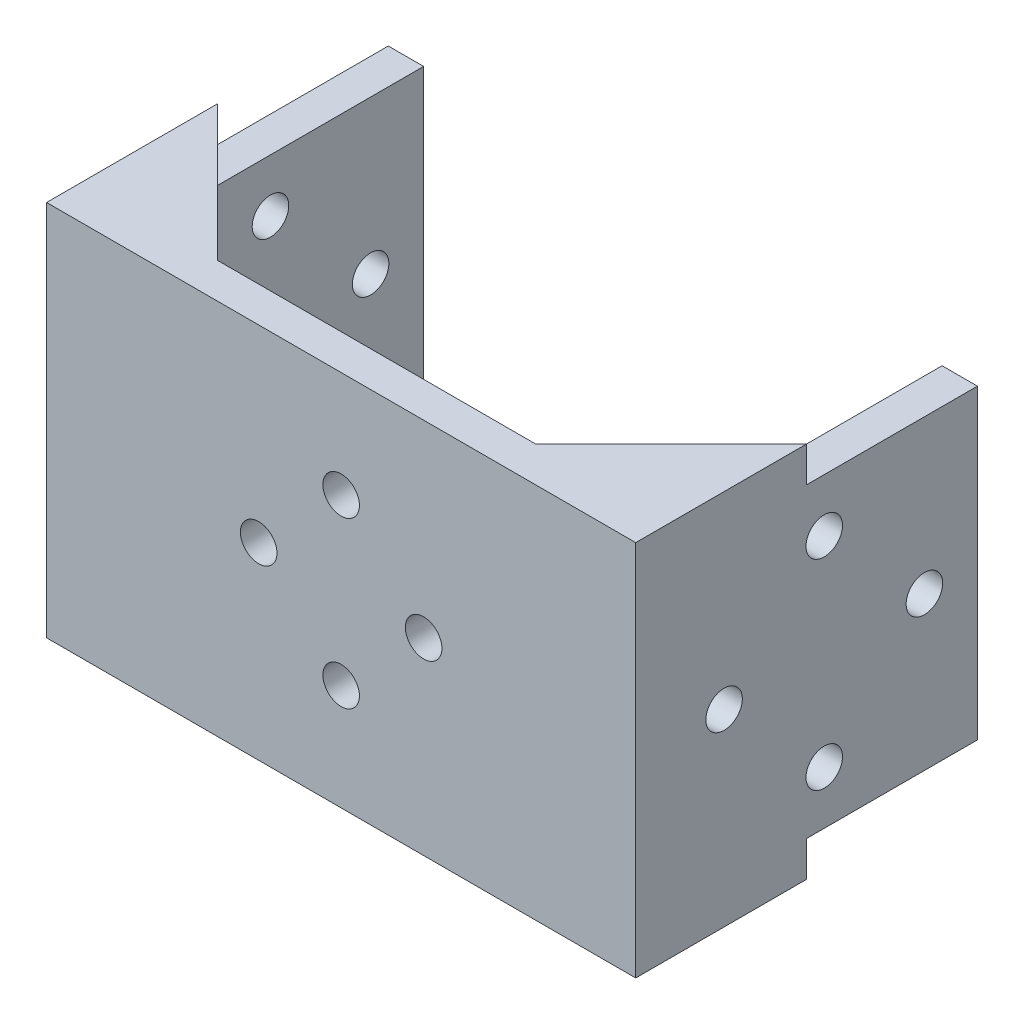
ISO-10303-21;
HEADER;
FILE_DESCRIPTION(('STEP AP214'),'2;1');
FILE_NAME('part.step','',(''),(''),'','','');
FILE_SCHEMA(('AUTOMOTIVE_DESIGN { 1 0 10303 214 1 1 1 1 }'));
ENDSEC;
DATA;
#1=APPLICATION_CONTEXT('core data for automotive mechanical design processes');
#2=APPLICATION_PROTOCOL_DEFINITION('international standard','automotive_design',2000,#1);
#3=PRODUCT_CONTEXT('',#1,'mechanical');
#4=PRODUCT('Part','Part','',(#3));
#5=PRODUCT_RELATED_PRODUCT_CATEGORY('part','',(#4));
#6=PRODUCT_DEFINITION_FORMATION('','',#4);
#7=PRODUCT_DEFINITION_CONTEXT('part definition',#1,'design');
#8=PRODUCT_DEFINITION('design','',#6,#7);
#9=PRODUCT_DEFINITION_SHAPE('','',#8);
#10=(LENGTH_UNIT() NAMED_UNIT(*) SI_UNIT(.MILLI.,.METRE.));
#11=(NAMED_UNIT(*) PLANE_ANGLE_UNIT() SI_UNIT($,.RADIAN.));
#12=(NAMED_UNIT(*) SI_UNIT($,.STERADIAN.) SOLID_ANGLE_UNIT());
#13=UNCERTAINTY_MEASURE_WITH_UNIT(LENGTH_MEASURE(1.E-05),#10,'distance_accuracy_value','');
#14=(GEOMETRIC_REPRESENTATION_CONTEXT(3) GLOBAL_UNCERTAINTY_ASSIGNED_CONTEXT((#13)) GLOBAL_UNIT_ASSIGNED_CONTEXT((#10,
#11,#12)) REPRESENTATION_CONTEXT('',''));
#15=CARTESIAN_POINT('',(0.,0.,0.));
#16=DIRECTION('',(0.,0.,1.));
#17=DIRECTION('',(1.,0.,0.));
#18=AXIS2_PLACEMENT_3D('',#15,#16,#17);
#19=CARTESIAN_POINT('',(-25.,-13.,3.));
#20=DIRECTION('',(0.,1.,0.));
#21=DIRECTION('',(0.,0.,1.));
#22=AXIS2_PLACEMENT_3D('',#19,#20,#21);
#23=PLANE('',#22);
#24=DIRECTION('',(0.,0.,-1.));
#25=VECTOR('',#24,1.);
#26=CARTESIAN_POINT('',(25.,-13.,3.));
#27=LINE('',#26,#25);
#28=CARTESIAN_POINT('',(25.,-13.,-11.5));
#29=VERTEX_POINT('',#28);
#30=CARTESIAN_POINT('',(25.,-13.,-26.));
#31=VERTEX_POINT('',#30);
#32=EDGE_CURVE('E428',#29,#31,#27,.T.);
#33=ORIENTED_EDGE('',*,*,#32,.F.);
#34=DIRECTION('',(-0.707106781186541,0.,0.707106781186554));
#35=VECTOR('',#34,1.);
#36=CARTESIAN_POINT('',(-7.24999999999956,-13.,20.7500000000001));
#37=LINE('',#36,#35);
#38=CARTESIAN_POINT('',(22.,-13.,-8.49999999999994));
#39=VERTEX_POINT('',#38);
#40=EDGE_CURVE('E198',#29,#39,#37,.T.);
#41=ORIENTED_EDGE('',*,*,#40,.T.);
#42=DIRECTION('',(0.,0.,1.));
#43=VECTOR('',#42,1.);
#44=CARTESIAN_POINT('',(22.,-13.,3.));
#45=LINE('',#44,#43);
#46=CARTESIAN_POINT('',(22.,-13.,-26.));
#47=VERTEX_POINT('',#46);
#48=EDGE_CURVE('E305',#47,#39,#45,.T.);
#49=ORIENTED_EDGE('',*,*,#48,.F.);
#50=DIRECTION('',(1.,0.,0.));
#51=VECTOR('',#50,1.);
#52=CARTESIAN_POINT('',(22.,-13.,-26.));
#53=LINE('',#52,#51);
#54=EDGE_CURVE('E317',#47,#31,#53,.T.);
#55=ORIENTED_EDGE('',*,*,#54,.T.);
#56=EDGE_LOOP('',(#33,#41,#49,#55));
#57=FACE_BOUND('',#56,.T.);
#58=ADVANCED_FACE('F39',(#57),#23,.F.);
#59=CARTESIAN_POINT('',(-25.,13.,3.));
#60=DIRECTION('',(0.,-1.,0.));
#61=DIRECTION('',(0.,0.,-1.));
#62=AXIS2_PLACEMENT_3D('',#59,#60,#61);
#63=PLANE('',#62);
#64=DIRECTION('',(-0.707106781186556,0.,-0.707106781186539));
#65=VECTOR('',#64,1.);
#66=CARTESIAN_POINT('',(-25.,13.,-11.5));
#67=LINE('',#66,#65);
#68=CARTESIAN_POINT('',(-22.,13.,-8.50000000000007));
#69=VERTEX_POINT('',#68);
#70=CARTESIAN_POINT('',(-25.,13.,-11.5));
#71=VERTEX_POINT('',#70);
#72=EDGE_CURVE('E49',#69,#71,#67,.T.);
#73=ORIENTED_EDGE('',*,*,#72,.F.);
#74=DIRECTION('',(0.,0.,-1.));
#75=VECTOR('',#74,1.);
#76=CARTESIAN_POINT('',(-22.,13.,3.));
#77=LINE('',#76,#75);
#78=CARTESIAN_POINT('',(-22.,13.,-26.));
#79=VERTEX_POINT('',#78);
#80=EDGE_CURVE('E368',#69,#79,#77,.T.);
#81=ORIENTED_EDGE('',*,*,#80,.T.);
#82=DIRECTION('',(-1.,0.,0.));
#83=VECTOR('',#82,1.);
#84=CARTESIAN_POINT('',(-22.,13.,-26.));
#85=LINE('',#84,#83);
#86=CARTESIAN_POINT('',(-25.,13.,-26.));
#87=VERTEX_POINT('',#86);
#88=EDGE_CURVE('E378',#79,#87,#85,.T.);
#89=ORIENTED_EDGE('',*,*,#88,.T.);
#90=DIRECTION('',(0.,0.,-1.));
#91=VECTOR('',#90,1.);
#92=CARTESIAN_POINT('',(-25.,13.,3.));
#93=LINE('',#92,#91);
#94=EDGE_CURVE('E439',#71,#87,#93,.T.);
#95=ORIENTED_EDGE('',*,*,#94,.F.);
#96=EDGE_LOOP('',(#73,#81,#89,#95));
#97=FACE_BOUND('',#96,.T.);
#98=ADVANCED_FACE('F516',(#97),#63,.F.);
#99=DIRECTION('',(-0.707106781186541,0.,0.707106781186554));
#100=VECTOR('',#99,1.);
#101=CARTESIAN_POINT('',(25.,13.,-11.5));
#102=LINE('',#101,#100);
#103=CARTESIAN_POINT('',(25.,13.,-11.5));
#104=VERTEX_POINT('',#103);
#105=CARTESIAN_POINT('',(22.,13.,-8.49999999999994));
#106=VERTEX_POINT('',#105);
#107=EDGE_CURVE('E250',#104,#106,#102,.T.);
#108=ORIENTED_EDGE('',*,*,#107,.F.);
#109=DIRECTION('',(0.,0.,-1.));
#110=VECTOR('',#109,1.);
#111=CARTESIAN_POINT('',(25.,13.,3.));
#112=LINE('',#111,#110);
#113=CARTESIAN_POINT('',(25.,13.,-26.));
#114=VERTEX_POINT('',#113);
#115=EDGE_CURVE('E43',#104,#114,#112,.T.);
#116=ORIENTED_EDGE('',*,*,#115,.T.);
#117=DIRECTION('',(1.,0.,0.));
#118=VECTOR('',#117,1.);
#119=CARTESIAN_POINT('',(22.,13.,-26.));
#120=LINE('',#119,#118);
#121=CARTESIAN_POINT('',(22.,13.,-26.));
#122=VERTEX_POINT('',#121);
#123=EDGE_CURVE('E324',#122,#114,#120,.T.);
#124=ORIENTED_EDGE('',*,*,#123,.F.);
#125=DIRECTION('',(0.,0.,-1.));
#126=VECTOR('',#125,1.);
#127=CARTESIAN_POINT('',(22.,13.,2.99999999999999));
#128=LINE('',#127,#126);
#129=EDGE_CURVE('E309',#106,#122,#128,.T.);
#130=ORIENTED_EDGE('',*,*,#129,.F.);
#131=EDGE_LOOP('',(#108,#116,#124,#130));
#132=FACE_BOUND('',#131,.T.);
#133=ADVANCED_FACE('F497',(#132),#63,.F.);
#134=CARTESIAN_POINT('',(0.,0.,3.));
#135=DIRECTION('',(0.,0.,-1.));
#136=DIRECTION('',(-1.,0.,0.));
#137=AXIS2_PLACEMENT_3D('',#134,#135,#136);
#138=PLANE('',#137);
#139=DIRECTION('',(0.,-1.,0.));
#140=VECTOR('',#139,1.);
#141=CARTESIAN_POINT('',(-25.,-13.,3.));
#142=LINE('',#141,#140);
#143=CARTESIAN_POINT('',(-25.,16.,3.));
#144=VERTEX_POINT('',#143);
#145=CARTESIAN_POINT('',(-25.,-16.,3.));
#146=VERTEX_POINT('',#145);
#147=EDGE_CURVE('E177',#144,#146,#142,.T.);
#148=ORIENTED_EDGE('',*,*,#147,.T.);
#149=DIRECTION('',(1.,0.,0.));
#150=VECTOR('',#149,1.);
#151=CARTESIAN_POINT('',(-25.,-16.,3.));
#152=LINE('',#151,#150);
#153=CARTESIAN_POINT('',(25.,-16.,3.));
#154=VERTEX_POINT('',#153);
#155=EDGE_CURVE('E185',#146,#154,#152,.T.);
#156=ORIENTED_EDGE('',*,*,#155,.T.);
#157=DIRECTION('',(0.,1.,0.));
#158=VECTOR('',#157,1.);
#159=CARTESIAN_POINT('',(25.,-13.,3.));
#160=LINE('',#159,#158);
#161=CARTESIAN_POINT('',(25.,16.,3.));
#162=VERTEX_POINT('',#161);
#163=EDGE_CURVE('E166',#154,#162,#160,.T.);
#164=ORIENTED_EDGE('',*,*,#163,.T.);
#165=DIRECTION('',(1.,0.,0.));
#166=VECTOR('',#165,1.);
#167=CARTESIAN_POINT('',(-25.,16.,3.));
#168=LINE('',#167,#166);
#169=EDGE_CURVE('E230',#144,#162,#168,.T.);
#170=ORIENTED_EDGE('',*,*,#169,.F.);
#171=EDGE_LOOP('',(#148,#156,#164,#170));
#172=FACE_BOUND('',#171,.T.);
#173=CARTESIAN_POINT('',(-7.,0.,3.));
#174=DIRECTION('',(0.,0.,1.));
#175=DIRECTION('',(1.,0.,0.));
#176=AXIS2_PLACEMENT_3D('',#173,#174,#175);
#177=CIRCLE('',#176,1.55);
#178=CARTESIAN_POINT('',(-5.45,0.,3.));
#179=VERTEX_POINT('',#178);
#180=EDGE_CURVE('E418',#179,#179,#177,.T.);
#181=ORIENTED_EDGE('',*,*,#180,.F.);
#182=EDGE_LOOP('',(#181));
#183=FACE_BOUND('',#182,.T.);
#184=CARTESIAN_POINT('',(0.,7.,3.));
#185=DIRECTION('',(0.,0.,1.));
#186=DIRECTION('',(1.,0.,0.));
#187=AXIS2_PLACEMENT_3D('',#184,#185,#186);
#188=CIRCLE('',#187,1.55);
#189=CARTESIAN_POINT('',(1.55000000000002,7.,3.));
#190=VERTEX_POINT('',#189);
#191=EDGE_CURVE('E410',#190,#190,#188,.T.);
#192=ORIENTED_EDGE('',*,*,#191,.F.);
#193=EDGE_LOOP('',(#192));
#194=FACE_BOUND('',#193,.T.);
#195=CARTESIAN_POINT('',(7.,0.,3.));
#196=DIRECTION('',(0.,0.,1.));
#197=DIRECTION('',(1.,0.,0.));
#198=AXIS2_PLACEMENT_3D('',#195,#196,#197);
#199=CIRCLE('',#198,1.55);
#200=CARTESIAN_POINT('',(8.55,0.,3.));
#201=VERTEX_POINT('',#200);
#202=EDGE_CURVE('E402',#201,#201,#199,.T.);
#203=ORIENTED_EDGE('',*,*,#202,.F.);
#204=EDGE_LOOP('',(#203));
#205=FACE_BOUND('',#204,.T.);
#206=CARTESIAN_POINT('',(0.,-7.,3.));
#207=DIRECTION('',(0.,0.,1.));
#208=DIRECTION('',(1.,0.,0.));
#209=AXIS2_PLACEMENT_3D('',#206,#207,#208);
#210=CIRCLE('',#209,1.55);
#211=CARTESIAN_POINT('',(1.54999999999993,-7.,3.));
#212=VERTEX_POINT('',#211);
#213=EDGE_CURVE('E394',#212,#212,#210,.T.);
#214=ORIENTED_EDGE('',*,*,#213,.F.);
#215=EDGE_LOOP('',(#214));
#216=FACE_BOUND('',#215,.T.);
#217=ADVANCED_FACE('F192',(#172,#183,#194,#205,#216),#138,.F.);
#218=CARTESIAN_POINT('',(0.,0.,0.));
#219=DIRECTION('',(0.,0.,-1.));
#220=DIRECTION('',(-1.,0.,0.));
#221=AXIS2_PLACEMENT_3D('',#218,#219,#220);
#222=PLANE('',#221);
#223=DIRECTION('',(0.,1.,0.));
#224=VECTOR('',#223,1.);
#225=CARTESIAN_POINT('',(22.,0.,0.));
#226=LINE('',#225,#224);
#227=CARTESIAN_POINT('',(22.,-13.,0.));
#228=VERTEX_POINT('',#227);
#229=CARTESIAN_POINT('',(22.,13.,0.));
#230=VERTEX_POINT('',#229);
#231=EDGE_CURVE('E328',#228,#230,#226,.T.);
#232=ORIENTED_EDGE('',*,*,#231,.F.);
#233=DIRECTION('',(1.,0.,0.));
#234=VECTOR('',#233,1.);
#235=CARTESIAN_POINT('',(-25.,-13.,0.));
#236=LINE('',#235,#234);
#237=CARTESIAN_POINT('',(13.5000000000002,-13.,0.));
#238=VERTEX_POINT('',#237);
#239=EDGE_CURVE('E432',#238,#228,#236,.T.);
#240=ORIENTED_EDGE('',*,*,#239,.F.);
#241=DIRECTION('',(0.,1.,0.));
#242=VECTOR('',#241,1.);
#243=CARTESIAN_POINT('',(13.5000000000002,-16.,0.));
#244=LINE('',#243,#242);
#245=CARTESIAN_POINT('',(13.5000000000002,-16.,0.));
#246=VERTEX_POINT('',#245);
#247=EDGE_CURVE('E224',#246,#238,#244,.T.);
#248=ORIENTED_EDGE('',*,*,#247,.F.);
#249=DIRECTION('',(-1.,0.,0.));
#250=VECTOR('',#249,1.);
#251=CARTESIAN_POINT('',(-25.,-16.,0.));
#252=LINE('',#251,#250);
#253=CARTESIAN_POINT('',(-13.4999999999997,-16.,0.));
#254=VERTEX_POINT('',#253);
#255=EDGE_CURVE('E202',#246,#254,#252,.T.);
#256=ORIENTED_EDGE('',*,*,#255,.T.);
#257=DIRECTION('',(0.,1.,0.));
#258=VECTOR('',#257,1.);
#259=CARTESIAN_POINT('',(-13.4999999999997,-16.,0.));
#260=LINE('',#259,#258);
#261=CARTESIAN_POINT('',(-13.4999999999997,-13.,0.));
#262=VERTEX_POINT('',#261);
#263=EDGE_CURVE('E220',#254,#262,#260,.T.);
#264=ORIENTED_EDGE('',*,*,#263,.T.);
#265=CARTESIAN_POINT('',(-22.,-13.,0.));
#266=VERTEX_POINT('',#265);
#267=EDGE_CURVE('E178',#266,#262,#236,.T.);
#268=ORIENTED_EDGE('',*,*,#267,.F.);
#269=DIRECTION('',(0.,-1.,0.));
#270=VECTOR('',#269,1.);
#271=CARTESIAN_POINT('',(-22.,0.,0.));
#272=LINE('',#271,#270);
#273=CARTESIAN_POINT('',(-22.,13.,0.));
#274=VERTEX_POINT('',#273);
#275=EDGE_CURVE('E386',#274,#266,#272,.T.);
#276=ORIENTED_EDGE('',*,*,#275,.F.);
#277=DIRECTION('',(-1.,0.,0.));
#278=VECTOR('',#277,1.);
#279=CARTESIAN_POINT('',(-25.,13.,0.));
#280=LINE('',#279,#278);
#281=CARTESIAN_POINT('',(-13.4999999999997,13.,0.));
#282=VERTEX_POINT('',#281);
#283=EDGE_CURVE('E422',#282,#274,#280,.T.);
#284=ORIENTED_EDGE('',*,*,#283,.F.);
#285=DIRECTION('',(0.,-1.,0.));
#286=VECTOR('',#285,1.);
#287=CARTESIAN_POINT('',(-13.4999999999997,16.,0.));
#288=LINE('',#287,#286);
#289=CARTESIAN_POINT('',(-13.4999999999997,16.,0.));
#290=VERTEX_POINT('',#289);
#291=EDGE_CURVE('E260',#290,#282,#288,.T.);
#292=ORIENTED_EDGE('',*,*,#291,.F.);
#293=DIRECTION('',(-1.,0.,0.));
#294=VECTOR('',#293,1.);
#295=CARTESIAN_POINT('',(-13.4999999999997,16.,0.));
#296=LINE('',#295,#294);
#297=CARTESIAN_POINT('',(13.5000000000002,16.,0.));
#298=VERTEX_POINT('',#297);
#299=EDGE_CURVE('E239',#298,#290,#296,.T.);
#300=ORIENTED_EDGE('',*,*,#299,.F.);
#301=DIRECTION('',(0.,-1.,0.));
#302=VECTOR('',#301,1.);
#303=CARTESIAN_POINT('',(13.5000000000002,16.,0.));
#304=LINE('',#303,#302);
#305=CARTESIAN_POINT('',(13.5000000000002,13.,0.));
#306=VERTEX_POINT('',#305);
#307=EDGE_CURVE('E264',#298,#306,#304,.T.);
#308=ORIENTED_EDGE('',*,*,#307,.T.);
#309=EDGE_CURVE('E429',#230,#306,#280,.T.);
#310=ORIENTED_EDGE('',*,*,#309,.F.);
#311=EDGE_LOOP('',(#232,#240,#248,#256,#264,#268,#276,#284,#292,#300,#308,#310));
#312=FACE_BOUND('',#311,.T.);
#313=CARTESIAN_POINT('',(7.,0.,0.));
#314=DIRECTION('',(0.,0.,1.));
#315=DIRECTION('',(1.,0.,0.));
#316=AXIS2_PLACEMENT_3D('',#313,#314,#315);
#317=CIRCLE('',#316,1.55);
#318=CARTESIAN_POINT('',(8.55,0.,0.));
#319=VERTEX_POINT('',#318);
#320=EDGE_CURVE('E398',#319,#319,#317,.T.);
#321=ORIENTED_EDGE('',*,*,#320,.T.);
#322=EDGE_LOOP('',(#321));
#323=FACE_BOUND('',#322,.T.);
#324=CARTESIAN_POINT('',(-7.,0.,0.));
#325=DIRECTION('',(0.,0.,1.));
#326=DIRECTION('',(1.,0.,0.));
#327=AXIS2_PLACEMENT_3D('',#324,#325,#326);
#328=CIRCLE('',#327,1.55);
#329=CARTESIAN_POINT('',(-5.45,0.,0.));
#330=VERTEX_POINT('',#329);
#331=EDGE_CURVE('E414',#330,#330,#328,.T.);
#332=ORIENTED_EDGE('',*,*,#331,.T.);
#333=EDGE_LOOP('',(#332));
#334=FACE_BOUND('',#333,.T.);
#335=CARTESIAN_POINT('',(0.,7.,0.));
#336=DIRECTION('',(0.,0.,1.));
#337=DIRECTION('',(1.,0.,0.));
#338=AXIS2_PLACEMENT_3D('',#335,#336,#337);
#339=CIRCLE('',#338,1.55);
#340=CARTESIAN_POINT('',(1.55000000000002,7.,0.));
#341=VERTEX_POINT('',#340);
#342=EDGE_CURVE('E406',#341,#341,#339,.T.);
#343=ORIENTED_EDGE('',*,*,#342,.T.);
#344=EDGE_LOOP('',(#343));
#345=FACE_BOUND('',#344,.T.);
#346=CARTESIAN_POINT('',(0.,-7.,0.));
#347=DIRECTION('',(0.,0.,1.));
#348=DIRECTION('',(1.,0.,0.));
#349=AXIS2_PLACEMENT_3D('',#346,#347,#348);
#350=CIRCLE('',#349,1.55);
#351=CARTESIAN_POINT('',(1.54999999999993,-7.,0.));
#352=VERTEX_POINT('',#351);
#353=EDGE_CURVE('E393',#352,#352,#350,.T.);
#354=ORIENTED_EDGE('',*,*,#353,.T.);
#355=EDGE_LOOP('',(#354));
#356=FACE_BOUND('',#355,.T.);
#357=ADVANCED_FACE('F470',(#312,#323,#334,#345,#356),#222,.T.);
#358=CARTESIAN_POINT('',(25.,-13.,3.));
#359=DIRECTION('',(-1.,0.,0.));
#360=DIRECTION('',(0.,0.,1.));
#361=AXIS2_PLACEMENT_3D('',#358,#359,#360);
#362=PLANE('',#361);
#363=ORIENTED_EDGE('',*,*,#163,.F.);
#364=DIRECTION('',(0.,0.,-1.));
#365=VECTOR('',#364,1.);
#366=CARTESIAN_POINT('',(25.,-16.,3.));
#367=LINE('',#366,#365);
#368=CARTESIAN_POINT('',(25.,-16.,-11.5));
#369=VERTEX_POINT('',#368);
#370=EDGE_CURVE('E169',#154,#369,#367,.T.);
#371=ORIENTED_EDGE('',*,*,#370,.T.);
#372=DIRECTION('',(0.,1.,0.));
#373=VECTOR('',#372,1.);
#374=CARTESIAN_POINT('',(25.,-16.,-11.5));
#375=LINE('',#374,#373);
#376=EDGE_CURVE('E212',#369,#29,#375,.T.);
#377=ORIENTED_EDGE('',*,*,#376,.T.);
#378=ORIENTED_EDGE('',*,*,#32,.T.);
#379=DIRECTION('',(0.,-1.,0.));
#380=VECTOR('',#379,1.);
#381=CARTESIAN_POINT('',(25.,-13.,-26.));
#382=LINE('',#381,#380);
#383=EDGE_CURVE('E301',#114,#31,#382,.T.);
#384=ORIENTED_EDGE('',*,*,#383,.F.);
#385=ORIENTED_EDGE('',*,*,#115,.F.);
#386=DIRECTION('',(0.,-1.,0.));
#387=VECTOR('',#386,1.);
#388=CARTESIAN_POINT('',(25.,16.,-11.5));
#389=LINE('',#388,#387);
#390=CARTESIAN_POINT('',(25.,16.,-11.5));
#391=VERTEX_POINT('',#390);
#392=EDGE_CURVE('E268',#391,#104,#389,.T.);
#393=ORIENTED_EDGE('',*,*,#392,.F.);
#394=DIRECTION('',(0.,0.,-1.));
#395=VECTOR('',#394,1.);
#396=CARTESIAN_POINT('',(25.,16.,3.));
#397=LINE('',#396,#395);
#398=EDGE_CURVE('E171',#162,#391,#397,.T.);
#399=ORIENTED_EDGE('',*,*,#398,.F.);
#400=EDGE_LOOP('',(#363,#371,#377,#378,#384,#385,#393,#399));
#401=FACE_BOUND('',#400,.T.);
#402=CARTESIAN_POINT('',(25.,0.,-4.5));
#403=DIRECTION('',(-1.,0.,0.));
#404=DIRECTION('',(0.,0.,1.));
#405=AXIS2_PLACEMENT_3D('',#402,#403,#404);
#406=CIRCLE('',#405,1.55);
#407=CARTESIAN_POINT('',(25.,0.,-2.95));
#408=VERTEX_POINT('',#407);
#409=EDGE_CURVE('E293',#408,#408,#406,.T.);
#410=ORIENTED_EDGE('',*,*,#409,.T.);
#411=EDGE_LOOP('',(#410));
#412=FACE_BOUND('',#411,.T.);
#413=CARTESIAN_POINT('',(25.,-8.50000000000012,-12.9999999999999));
#414=DIRECTION('',(-1.,0.,0.));
#415=DIRECTION('',(0.,0.,1.));
#416=AXIS2_PLACEMENT_3D('',#413,#414,#415);
#417=CIRCLE('',#416,1.55);
#418=CARTESIAN_POINT('',(25.,-8.50000000000012,-11.4499999999999));
#419=VERTEX_POINT('',#418);
#420=EDGE_CURVE('E285',#419,#419,#417,.T.);
#421=ORIENTED_EDGE('',*,*,#420,.T.);
#422=EDGE_LOOP('',(#421));
#423=FACE_BOUND('',#422,.T.);
#424=CARTESIAN_POINT('',(25.,-1.82433262375143E-13,-21.5));
#425=DIRECTION('',(-1.,0.,0.));
#426=DIRECTION('',(0.,0.,1.));
#427=AXIS2_PLACEMENT_3D('',#424,#425,#426);
#428=CIRCLE('',#427,1.55);
#429=CARTESIAN_POINT('',(25.,-1.82433262375143E-13,-19.95));
#430=VERTEX_POINT('',#429);
#431=EDGE_CURVE('E277',#430,#430,#428,.T.);
#432=ORIENTED_EDGE('',*,*,#431,.T.);
#433=EDGE_LOOP('',(#432));
#434=FACE_BOUND('',#433,.T.);
#435=CARTESIAN_POINT('',(25.,8.49999999999988,-13.));
#436=DIRECTION('',(-1.,0.,0.));
#437=DIRECTION('',(0.,0.,1.));
#438=AXIS2_PLACEMENT_3D('',#435,#436,#437);
#439=CIRCLE('',#438,1.55);
#440=CARTESIAN_POINT('',(25.,8.49999999999988,-11.45));
#441=VERTEX_POINT('',#440);
#442=EDGE_CURVE('E272',#441,#441,#439,.T.);
#443=ORIENTED_EDGE('',*,*,#442,.T.);
#444=EDGE_LOOP('',(#443));
#445=FACE_BOUND('',#444,.T.);
#446=ADVANCED_FACE('F41',(#401,#412,#423,#434,#445),#362,.F.);
#447=CARTESIAN_POINT('',(-25.,-13.,3.));
#448=DIRECTION('',(1.,0.,0.));
#449=DIRECTION('',(0.,0.,-1.));
#450=AXIS2_PLACEMENT_3D('',#447,#448,#449);
#451=PLANE('',#450);
#452=ORIENTED_EDGE('',*,*,#147,.F.);
#453=DIRECTION('',(0.,0.,1.));
#454=VECTOR('',#453,1.);
#455=CARTESIAN_POINT('',(-25.,16.,3.));
#456=LINE('',#455,#454);
#457=CARTESIAN_POINT('',(-25.,16.,-11.5));
#458=VERTEX_POINT('',#457);
#459=EDGE_CURVE('E245',#458,#144,#456,.T.);
#460=ORIENTED_EDGE('',*,*,#459,.F.);
#461=DIRECTION('',(0.,-1.,0.));
#462=VECTOR('',#461,1.);
#463=CARTESIAN_POINT('',(-25.,16.,-11.5));
#464=LINE('',#463,#462);
#465=EDGE_CURVE('E249',#458,#71,#464,.T.);
#466=ORIENTED_EDGE('',*,*,#465,.T.);
#467=ORIENTED_EDGE('',*,*,#94,.T.);
#468=DIRECTION('',(0.,-1.,0.));
#469=VECTOR('',#468,1.);
#470=CARTESIAN_POINT('',(-25.,-13.,-26.));
#471=LINE('',#470,#469);
#472=CARTESIAN_POINT('',(-25.,-13.,-26.));
#473=VERTEX_POINT('',#472);
#474=EDGE_CURVE('E360',#87,#473,#471,.T.);
#475=ORIENTED_EDGE('',*,*,#474,.T.);
#476=DIRECTION('',(0.,0.,-1.));
#477=VECTOR('',#476,1.);
#478=CARTESIAN_POINT('',(-25.,-13.,3.));
#479=LINE('',#478,#477);
#480=CARTESIAN_POINT('',(-25.,-13.,-11.5));
#481=VERTEX_POINT('',#480);
#482=EDGE_CURVE('E437',#481,#473,#479,.T.);
#483=ORIENTED_EDGE('',*,*,#482,.F.);
#484=DIRECTION('',(0.,1.,0.));
#485=VECTOR('',#484,1.);
#486=CARTESIAN_POINT('',(-25.,-16.,-11.5));
#487=LINE('',#486,#485);
#488=CARTESIAN_POINT('',(-25.,-16.,-11.5));
#489=VERTEX_POINT('',#488);
#490=EDGE_CURVE('E58',#489,#481,#487,.T.);
#491=ORIENTED_EDGE('',*,*,#490,.F.);
#492=DIRECTION('',(0.,0.,1.));
#493=VECTOR('',#492,1.);
#494=CARTESIAN_POINT('',(-25.,-16.,3.));
#495=LINE('',#494,#493);
#496=EDGE_CURVE('E209',#489,#146,#495,.T.);
#497=ORIENTED_EDGE('',*,*,#496,.T.);
#498=EDGE_LOOP('',(#452,#460,#466,#467,#475,#483,#491,#497));
#499=FACE_BOUND('',#498,.T.);
#500=CARTESIAN_POINT('',(-25.,8.49999999999988,-13.));
#501=DIRECTION('',(-1.,0.,0.));
#502=DIRECTION('',(0.,0.,1.));
#503=AXIS2_PLACEMENT_3D('',#500,#501,#502);
#504=CIRCLE('',#503,1.55);
#505=CARTESIAN_POINT('',(-25.,8.49999999999988,-11.45));
#506=VERTEX_POINT('',#505);
#507=EDGE_CURVE('E331',#506,#506,#504,.T.);
#508=ORIENTED_EDGE('',*,*,#507,.F.);
#509=EDGE_LOOP('',(#508));
#510=FACE_BOUND('',#509,.T.);
#511=CARTESIAN_POINT('',(-25.,-1.82433262375143E-13,-21.5));
#512=DIRECTION('',(-1.,0.,0.));
#513=DIRECTION('',(0.,0.,1.));
#514=AXIS2_PLACEMENT_3D('',#511,#512,#513);
#515=CIRCLE('',#514,1.55);
#516=CARTESIAN_POINT('',(-25.,-1.82433262375143E-13,-19.95));
#517=VERTEX_POINT('',#516);
#518=EDGE_CURVE('E336',#517,#517,#515,.T.);
#519=ORIENTED_EDGE('',*,*,#518,.F.);
#520=EDGE_LOOP('',(#519));
#521=FACE_BOUND('',#520,.T.);
#522=CARTESIAN_POINT('',(-25.,-8.50000000000012,-12.9999999999999));
#523=DIRECTION('',(-1.,0.,0.));
#524=DIRECTION('',(0.,0.,1.));
#525=AXIS2_PLACEMENT_3D('',#522,#523,#524);
#526=CIRCLE('',#525,1.55);
#527=CARTESIAN_POINT('',(-25.,-8.50000000000012,-11.4499999999999));
#528=VERTEX_POINT('',#527);
#529=EDGE_CURVE('E344',#528,#528,#526,.T.);
#530=ORIENTED_EDGE('',*,*,#529,.F.);
#531=EDGE_LOOP('',(#530));
#532=FACE_BOUND('',#531,.T.);
#533=CARTESIAN_POINT('',(-25.,0.,-4.5));
#534=DIRECTION('',(-1.,0.,0.));
#535=DIRECTION('',(0.,0.,1.));
#536=AXIS2_PLACEMENT_3D('',#533,#534,#535);
#537=CIRCLE('',#536,1.55);
#538=CARTESIAN_POINT('',(-25.,0.,-2.95));
#539=VERTEX_POINT('',#538);
#540=EDGE_CURVE('E352',#539,#539,#537,.T.);
#541=ORIENTED_EDGE('',*,*,#540,.F.);
#542=EDGE_LOOP('',(#541));
#543=FACE_BOUND('',#542,.T.);
#544=ADVANCED_FACE('F453',(#499,#510,#521,#532,#543),#451,.F.);
#545=DIRECTION('',(0.,0.,1.));
#546=VECTOR('',#545,1.);
#547=CARTESIAN_POINT('',(-22.,-13.,3.));
#548=LINE('',#547,#546);
#549=CARTESIAN_POINT('',(-22.,-13.,-26.));
#550=VERTEX_POINT('',#549);
#551=CARTESIAN_POINT('',(-22.,-13.,-8.50000000000007));
#552=VERTEX_POINT('',#551);
#553=EDGE_CURVE('E364',#550,#552,#548,.T.);
#554=ORIENTED_EDGE('',*,*,#553,.T.);
#555=DIRECTION('',(-0.707106781186556,0.,-0.707106781186539));
#556=VECTOR('',#555,1.);
#557=CARTESIAN_POINT('',(-17.75,-13.,-4.25000000000018));
#558=LINE('',#557,#556);
#559=EDGE_CURVE('E11',#552,#481,#558,.T.);
#560=ORIENTED_EDGE('',*,*,#559,.T.);
#561=ORIENTED_EDGE('',*,*,#482,.T.);
#562=DIRECTION('',(-1.,0.,0.));
#563=VECTOR('',#562,1.);
#564=CARTESIAN_POINT('',(-22.,-13.,-26.));
#565=LINE('',#564,#563);
#566=EDGE_CURVE('E382',#550,#473,#565,.T.);
#567=ORIENTED_EDGE('',*,*,#566,.F.);
#568=EDGE_LOOP('',(#554,#560,#561,#567));
#569=FACE_BOUND('',#568,.T.);
#570=ADVANCED_FACE('F521',(#569),#23,.F.);
#571=CARTESIAN_POINT('',(-7.,0.,3.));
#572=DIRECTION('',(0.,0.,-1.));
#573=DIRECTION('',(-1.,0.,0.));
#574=AXIS2_PLACEMENT_3D('',#571,#572,#573);
#575=CYLINDRICAL_SURFACE('',#574,1.55);
#576=ORIENTED_EDGE('',*,*,#180,.T.);
#577=EDGE_LOOP('',(#576));
#578=FACE_BOUND('',#577,.T.);
#579=ORIENTED_EDGE('',*,*,#331,.F.);
#580=EDGE_LOOP('',(#579));
#581=FACE_BOUND('',#580,.T.);
#582=ADVANCED_FACE('F543',(#578,#581),#575,.F.);
#583=CARTESIAN_POINT('',(0.,7.,3.));
#584=DIRECTION('',(0.,0.,-1.));
#585=DIRECTION('',(-1.,0.,0.));
#586=AXIS2_PLACEMENT_3D('',#583,#584,#585);
#587=CYLINDRICAL_SURFACE('',#586,1.55);
#588=ORIENTED_EDGE('',*,*,#191,.T.);
#589=EDGE_LOOP('',(#588));
#590=FACE_BOUND('',#589,.T.);
#591=ORIENTED_EDGE('',*,*,#342,.F.);
#592=EDGE_LOOP('',(#591));
#593=FACE_BOUND('',#592,.T.);
#594=ADVANCED_FACE('F549',(#590,#593),#587,.F.);
#595=CARTESIAN_POINT('',(7.,0.,3.));
#596=DIRECTION('',(0.,0.,-1.));
#597=DIRECTION('',(-1.,0.,0.));
#598=AXIS2_PLACEMENT_3D('',#595,#596,#597);
#599=CYLINDRICAL_SURFACE('',#598,1.55);
#600=ORIENTED_EDGE('',*,*,#202,.T.);
#601=EDGE_LOOP('',(#600));
#602=FACE_BOUND('',#601,.T.);
#603=ORIENTED_EDGE('',*,*,#320,.F.);
#604=EDGE_LOOP('',(#603));
#605=FACE_BOUND('',#604,.T.);
#606=ADVANCED_FACE('F565',(#602,#605),#599,.F.);
#607=CARTESIAN_POINT('',(0.,-7.,3.));
#608=DIRECTION('',(0.,0.,-1.));
#609=DIRECTION('',(-1.,0.,0.));
#610=AXIS2_PLACEMENT_3D('',#607,#608,#609);
#611=CYLINDRICAL_SURFACE('',#610,1.55);
#612=ORIENTED_EDGE('',*,*,#213,.T.);
#613=EDGE_LOOP('',(#612));
#614=FACE_BOUND('',#613,.T.);
#615=ORIENTED_EDGE('',*,*,#353,.F.);
#616=EDGE_LOOP('',(#615));
#617=FACE_BOUND('',#616,.T.);
#618=ADVANCED_FACE('F569',(#614,#617),#611,.F.);
#619=CARTESIAN_POINT('',(-22.,-13.,-26.));
#620=DIRECTION('',(0.,0.,-1.));
#621=DIRECTION('',(-1.,0.,0.));
#622=AXIS2_PLACEMENT_3D('',#619,#620,#621);
#623=PLANE('',#622);
#624=ORIENTED_EDGE('',*,*,#474,.F.);
#625=ORIENTED_EDGE('',*,*,#88,.F.);
#626=DIRECTION('',(0.,-1.,0.));
#627=VECTOR('',#626,1.);
#628=CARTESIAN_POINT('',(-22.,-13.,-26.));
#629=LINE('',#628,#627);
#630=EDGE_CURVE('E374',#79,#550,#629,.T.);
#631=ORIENTED_EDGE('',*,*,#630,.T.);
#632=ORIENTED_EDGE('',*,*,#566,.T.);
#633=EDGE_LOOP('',(#624,#625,#631,#632));
#634=FACE_BOUND('',#633,.T.);
#635=ADVANCED_FACE('F519',(#634),#623,.T.);
#636=CARTESIAN_POINT('',(-22.,0.,0.));
#637=DIRECTION('',(1.,0.,0.));
#638=DIRECTION('',(0.,0.,-1.));
#639=AXIS2_PLACEMENT_3D('',#636,#637,#638);
#640=PLANE('',#639);
#641=CARTESIAN_POINT('',(-22.,8.49999999999988,-13.));
#642=DIRECTION('',(-1.,0.,0.));
#643=DIRECTION('',(0.,0.,1.));
#644=AXIS2_PLACEMENT_3D('',#641,#642,#643);
#645=CIRCLE('',#644,1.55);
#646=CARTESIAN_POINT('',(-22.,8.49999999999988,-11.45));
#647=VERTEX_POINT('',#646);
#648=EDGE_CURVE('E332',#647,#647,#645,.T.);
#649=ORIENTED_EDGE('',*,*,#648,.T.);
#650=EDGE_LOOP('',(#649));
#651=FACE_BOUND('',#650,.T.);
#652=CARTESIAN_POINT('',(-22.,-1.82433262375143E-13,-21.5));
#653=DIRECTION('',(-1.,0.,0.));
#654=DIRECTION('',(0.,0.,1.));
#655=AXIS2_PLACEMENT_3D('',#652,#653,#654);
#656=CIRCLE('',#655,1.55);
#657=CARTESIAN_POINT('',(-22.,-1.82433262375143E-13,-19.95));
#658=VERTEX_POINT('',#657);
#659=EDGE_CURVE('E340',#658,#658,#656,.T.);
#660=ORIENTED_EDGE('',*,*,#659,.T.);
#661=EDGE_LOOP('',(#660));
#662=FACE_BOUND('',#661,.T.);
#663=CARTESIAN_POINT('',(-22.,-8.50000000000012,-12.9999999999999));
#664=DIRECTION('',(-1.,0.,0.));
#665=DIRECTION('',(0.,0.,1.));
#666=AXIS2_PLACEMENT_3D('',#663,#664,#665);
#667=CIRCLE('',#666,1.55);
#668=CARTESIAN_POINT('',(-22.,-8.50000000000012,-11.4499999999999));
#669=VERTEX_POINT('',#668);
#670=EDGE_CURVE('E348',#669,#669,#667,.T.);
#671=ORIENTED_EDGE('',*,*,#670,.T.);
#672=EDGE_LOOP('',(#671));
#673=FACE_BOUND('',#672,.T.);
#674=CARTESIAN_POINT('',(-22.,0.,-4.5));
#675=DIRECTION('',(-1.,0.,0.));
#676=DIRECTION('',(0.,0.,1.));
#677=AXIS2_PLACEMENT_3D('',#674,#675,#676);
#678=CIRCLE('',#677,1.55);
#679=CARTESIAN_POINT('',(-22.,0.,-2.95));
#680=VERTEX_POINT('',#679);
#681=EDGE_CURVE('E356',#680,#680,#678,.T.);
#682=ORIENTED_EDGE('',*,*,#681,.T.);
#683=EDGE_LOOP('',(#682));
#684=FACE_BOUND('',#683,.T.);
#685=EDGE_CURVE('E370',#274,#69,#77,.T.);
#686=ORIENTED_EDGE('',*,*,#685,.F.);
#687=ORIENTED_EDGE('',*,*,#275,.T.);
#688=EDGE_CURVE('E369',#552,#266,#548,.T.);
#689=ORIENTED_EDGE('',*,*,#688,.F.);
#690=ORIENTED_EDGE('',*,*,#553,.F.);
#691=ORIENTED_EDGE('',*,*,#630,.F.);
#692=ORIENTED_EDGE('',*,*,#80,.F.);
#693=EDGE_LOOP('',(#686,#687,#689,#690,#691,#692));
#694=FACE_BOUND('',#693,.T.);
#695=ADVANCED_FACE('F465',(#651,#662,#673,#684,#694),#640,.T.);
#696=CARTESIAN_POINT('',(-22.,0.,-4.5));
#697=DIRECTION('',(-1.,0.,0.));
#698=DIRECTION('',(0.,0.,1.));
#699=AXIS2_PLACEMENT_3D('',#696,#697,#698);
#700=CYLINDRICAL_SURFACE('',#699,1.55);
#701=ORIENTED_EDGE('',*,*,#681,.F.);
#702=EDGE_LOOP('',(#701));
#703=FACE_BOUND('',#702,.T.);
#704=ORIENTED_EDGE('',*,*,#540,.T.);
#705=EDGE_LOOP('',(#704));
#706=FACE_BOUND('',#705,.T.);
#707=ADVANCED_FACE('F577',(#703,#706),#700,.F.);
#708=CARTESIAN_POINT('',(-22.,-8.50000000000012,-12.9999999999999));
#709=DIRECTION('',(-1.,0.,0.));
#710=DIRECTION('',(0.,0.,1.));
#711=AXIS2_PLACEMENT_3D('',#708,#709,#710);
#712=CYLINDRICAL_SURFACE('',#711,1.55);
#713=ORIENTED_EDGE('',*,*,#670,.F.);
#714=EDGE_LOOP('',(#713));
#715=FACE_BOUND('',#714,.T.);
#716=ORIENTED_EDGE('',*,*,#529,.T.);
#717=EDGE_LOOP('',(#716));
#718=FACE_BOUND('',#717,.T.);
#719=ADVANCED_FACE('F581',(#715,#718),#712,.F.);
#720=CARTESIAN_POINT('',(-22.,-1.82433262375143E-13,-21.5));
#721=DIRECTION('',(-1.,0.,0.));
#722=DIRECTION('',(0.,0.,1.));
#723=AXIS2_PLACEMENT_3D('',#720,#721,#722);
#724=CYLINDRICAL_SURFACE('',#723,1.55);
#725=ORIENTED_EDGE('',*,*,#659,.F.);
#726=EDGE_LOOP('',(#725));
#727=FACE_BOUND('',#726,.T.);
#728=ORIENTED_EDGE('',*,*,#518,.T.);
#729=EDGE_LOOP('',(#728));
#730=FACE_BOUND('',#729,.T.);
#731=ADVANCED_FACE('F585',(#727,#730),#724,.F.);
#732=CARTESIAN_POINT('',(-22.,8.49999999999988,-13.));
#733=DIRECTION('',(-1.,0.,0.));
#734=DIRECTION('',(0.,0.,1.));
#735=AXIS2_PLACEMENT_3D('',#732,#733,#734);
#736=CYLINDRICAL_SURFACE('',#735,1.55);
#737=ORIENTED_EDGE('',*,*,#648,.F.);
#738=EDGE_LOOP('',(#737));
#739=FACE_BOUND('',#738,.T.);
#740=ORIENTED_EDGE('',*,*,#507,.T.);
#741=EDGE_LOOP('',(#740));
#742=FACE_BOUND('',#741,.T.);
#743=ADVANCED_FACE('F589',(#739,#742),#736,.F.);
#744=CARTESIAN_POINT('',(22.,0.,0.));
#745=DIRECTION('',(-1.,0.,0.));
#746=DIRECTION('',(0.,0.,1.));
#747=AXIS2_PLACEMENT_3D('',#744,#745,#746);
#748=PLANE('',#747);
#749=CARTESIAN_POINT('',(22.,-1.82433262375143E-13,-21.5));
#750=DIRECTION('',(-1.,0.,0.));
#751=DIRECTION('',(0.,0.,1.));
#752=AXIS2_PLACEMENT_3D('',#749,#750,#751);
#753=CIRCLE('',#752,1.55);
#754=CARTESIAN_POINT('',(22.,-1.82433262375143E-13,-19.95));
#755=VERTEX_POINT('',#754);
#756=EDGE_CURVE('E281',#755,#755,#753,.T.);
#757=ORIENTED_EDGE('',*,*,#756,.F.);
#758=EDGE_LOOP('',(#757));
#759=FACE_BOUND('',#758,.T.);
#760=CARTESIAN_POINT('',(22.,0.,-4.5));
#761=DIRECTION('',(-1.,0.,0.));
#762=DIRECTION('',(0.,0.,1.));
#763=AXIS2_PLACEMENT_3D('',#760,#761,#762);
#764=CIRCLE('',#763,1.55);
#765=CARTESIAN_POINT('',(22.,0.,-2.95));
#766=VERTEX_POINT('',#765);
#767=EDGE_CURVE('E297',#766,#766,#764,.T.);
#768=ORIENTED_EDGE('',*,*,#767,.F.);
#769=EDGE_LOOP('',(#768));
#770=FACE_BOUND('',#769,.T.);
#771=ORIENTED_EDGE('',*,*,#48,.T.);
#772=EDGE_CURVE('E310',#39,#228,#45,.T.);
#773=ORIENTED_EDGE('',*,*,#772,.T.);
#774=ORIENTED_EDGE('',*,*,#231,.T.);
#775=EDGE_CURVE('E311',#230,#106,#128,.T.);
#776=ORIENTED_EDGE('',*,*,#775,.T.);
#777=ORIENTED_EDGE('',*,*,#129,.T.);
#778=DIRECTION('',(0.,-1.,0.));
#779=VECTOR('',#778,1.);
#780=CARTESIAN_POINT('',(22.,-13.,-26.));
#781=LINE('',#780,#779);
#782=EDGE_CURVE('E314',#122,#47,#781,.T.);
#783=ORIENTED_EDGE('',*,*,#782,.T.);
#784=EDGE_LOOP('',(#771,#773,#774,#776,#777,#783));
#785=FACE_BOUND('',#784,.T.);
#786=CARTESIAN_POINT('',(22.,-8.50000000000012,-12.9999999999999));
#787=DIRECTION('',(-1.,0.,0.));
#788=DIRECTION('',(0.,0.,1.));
#789=AXIS2_PLACEMENT_3D('',#786,#787,#788);
#790=CIRCLE('',#789,1.55);
#791=CARTESIAN_POINT('',(22.,-8.50000000000012,-11.4499999999999));
#792=VERTEX_POINT('',#791);
#793=EDGE_CURVE('E289',#792,#792,#790,.T.);
#794=ORIENTED_EDGE('',*,*,#793,.F.);
#795=EDGE_LOOP('',(#794));
#796=FACE_BOUND('',#795,.T.);
#797=CARTESIAN_POINT('',(22.,8.49999999999988,-13.));
#798=DIRECTION('',(-1.,0.,0.));
#799=DIRECTION('',(0.,0.,1.));
#800=AXIS2_PLACEMENT_3D('',#797,#798,#799);
#801=CIRCLE('',#800,1.55);
#802=CARTESIAN_POINT('',(22.,8.49999999999988,-11.45));
#803=VERTEX_POINT('',#802);
#804=EDGE_CURVE('E273',#803,#803,#801,.T.);
#805=ORIENTED_EDGE('',*,*,#804,.F.);
#806=EDGE_LOOP('',(#805));
#807=FACE_BOUND('',#806,.T.);
#808=ADVANCED_FACE('F495',(#759,#770,#785,#796,#807),#748,.T.);
#809=CARTESIAN_POINT('',(22.,-13.,-26.));
#810=DIRECTION('',(0.,0.,1.));
#811=DIRECTION('',(1.,0.,0.));
#812=AXIS2_PLACEMENT_3D('',#809,#810,#811);
#813=PLANE('',#812);
#814=ORIENTED_EDGE('',*,*,#383,.T.);
#815=ORIENTED_EDGE('',*,*,#54,.F.);
#816=ORIENTED_EDGE('',*,*,#782,.F.);
#817=ORIENTED_EDGE('',*,*,#123,.T.);
#818=EDGE_LOOP('',(#814,#815,#816,#817));
#819=FACE_BOUND('',#818,.T.);
#820=ADVANCED_FACE('F502',(#819),#813,.F.);
#821=CARTESIAN_POINT('',(22.,0.,-4.5));
#822=DIRECTION('',(1.,0.,0.));
#823=DIRECTION('',(0.,0.,-1.));
#824=AXIS2_PLACEMENT_3D('',#821,#822,#823);
#825=CYLINDRICAL_SURFACE('',#824,1.55);
#826=ORIENTED_EDGE('',*,*,#767,.T.);
#827=EDGE_LOOP('',(#826));
#828=FACE_BOUND('',#827,.T.);
#829=ORIENTED_EDGE('',*,*,#409,.F.);
#830=EDGE_LOOP('',(#829));
#831=FACE_BOUND('',#830,.T.);
#832=ADVANCED_FACE('F596',(#828,#831),#825,.F.);
#833=CARTESIAN_POINT('',(22.,-8.50000000000012,-12.9999999999999));
#834=DIRECTION('',(1.,0.,0.));
#835=DIRECTION('',(0.,0.,-1.));
#836=AXIS2_PLACEMENT_3D('',#833,#834,#835);
#837=CYLINDRICAL_SURFACE('',#836,1.55);
#838=ORIENTED_EDGE('',*,*,#793,.T.);
#839=EDGE_LOOP('',(#838));
#840=FACE_BOUND('',#839,.T.);
#841=ORIENTED_EDGE('',*,*,#420,.F.);
#842=EDGE_LOOP('',(#841));
#843=FACE_BOUND('',#842,.T.);
#844=ADVANCED_FACE('F602',(#840,#843),#837,.F.);
#845=CARTESIAN_POINT('',(22.,-1.82433262375143E-13,-21.5));
#846=DIRECTION('',(1.,0.,0.));
#847=DIRECTION('',(0.,0.,-1.));
#848=AXIS2_PLACEMENT_3D('',#845,#846,#847);
#849=CYLINDRICAL_SURFACE('',#848,1.55);
#850=ORIENTED_EDGE('',*,*,#756,.T.);
#851=EDGE_LOOP('',(#850));
#852=FACE_BOUND('',#851,.T.);
#853=ORIENTED_EDGE('',*,*,#431,.F.);
#854=EDGE_LOOP('',(#853));
#855=FACE_BOUND('',#854,.T.);
#856=ADVANCED_FACE('F606',(#852,#855),#849,.F.);
#857=CARTESIAN_POINT('',(22.,8.49999999999988,-13.));
#858=DIRECTION('',(1.,0.,0.));
#859=DIRECTION('',(0.,0.,-1.));
#860=AXIS2_PLACEMENT_3D('',#857,#858,#859);
#861=CYLINDRICAL_SURFACE('',#860,1.55);
#862=ORIENTED_EDGE('',*,*,#804,.T.);
#863=EDGE_LOOP('',(#862));
#864=FACE_BOUND('',#863,.T.);
#865=ORIENTED_EDGE('',*,*,#442,.F.);
#866=EDGE_LOOP('',(#865));
#867=FACE_BOUND('',#866,.T.);
#868=ADVANCED_FACE('F610',(#864,#867),#861,.F.);
#869=CARTESIAN_POINT('',(0.,13.,0.));
#870=DIRECTION('',(0.,1.,0.));
#871=DIRECTION('',(0.,0.,1.));
#872=AXIS2_PLACEMENT_3D('',#869,#870,#871);
#873=PLANE('',#872);
#874=EDGE_CURVE('E233',#282,#69,#67,.T.);
#875=ORIENTED_EDGE('',*,*,#874,.F.);
#876=ORIENTED_EDGE('',*,*,#283,.T.);
#877=ORIENTED_EDGE('',*,*,#685,.T.);
#878=EDGE_LOOP('',(#875,#876,#877));
#879=FACE_BOUND('',#878,.T.);
#880=ADVANCED_FACE('F462',(#879),#873,.F.);
#881=CARTESIAN_POINT('',(25.,16.,-11.5));
#882=DIRECTION('',(0.707106781186554,0.,0.707106781186541));
#883=DIRECTION('',(0.707106781186541,0.,-0.707106781186554));
#884=AXIS2_PLACEMENT_3D('',#881,#882,#883);
#885=PLANE('',#884);
#886=ORIENTED_EDGE('',*,*,#107,.T.);
#887=EDGE_CURVE('E219',#106,#306,#102,.T.);
#888=ORIENTED_EDGE('',*,*,#887,.T.);
#889=ORIENTED_EDGE('',*,*,#307,.F.);
#890=DIRECTION('',(-0.707106781186541,0.,0.707106781186554));
#891=VECTOR('',#890,1.);
#892=CARTESIAN_POINT('',(25.,16.,-11.5));
#893=LINE('',#892,#891);
#894=EDGE_CURVE('E236',#391,#298,#893,.T.);
#895=ORIENTED_EDGE('',*,*,#894,.F.);
#896=ORIENTED_EDGE('',*,*,#392,.T.);
#897=EDGE_LOOP('',(#886,#888,#889,#895,#896));
#898=FACE_BOUND('',#897,.T.);
#899=ADVANCED_FACE('F486',(#898),#885,.F.);
#900=CARTESIAN_POINT('',(-25.,16.,-11.5));
#901=DIRECTION('',(-0.707106781186539,0.,0.707106781186556));
#902=DIRECTION('',(0.707106781186556,0.,0.707106781186539));
#903=AXIS2_PLACEMENT_3D('',#900,#901,#902);
#904=PLANE('',#903);
#905=ORIENTED_EDGE('',*,*,#874,.T.);
#906=ORIENTED_EDGE('',*,*,#72,.T.);
#907=ORIENTED_EDGE('',*,*,#465,.F.);
#908=DIRECTION('',(-0.707106781186556,0.,-0.707106781186539));
#909=VECTOR('',#908,1.);
#910=CARTESIAN_POINT('',(-25.,16.,-11.5));
#911=LINE('',#910,#909);
#912=EDGE_CURVE('E242',#290,#458,#911,.T.);
#913=ORIENTED_EDGE('',*,*,#912,.F.);
#914=ORIENTED_EDGE('',*,*,#291,.T.);
#915=EDGE_LOOP('',(#905,#906,#907,#913,#914));
#916=FACE_BOUND('',#915,.T.);
#917=ADVANCED_FACE('F449',(#916),#904,.F.);
#918=CARTESIAN_POINT('',(0.,16.,0.));
#919=DIRECTION('',(0.,1.,0.));
#920=DIRECTION('',(0.,0.,1.));
#921=AXIS2_PLACEMENT_3D('',#918,#919,#920);
#922=PLANE('',#921);
#923=ORIENTED_EDGE('',*,*,#169,.T.);
#924=ORIENTED_EDGE('',*,*,#398,.T.);
#925=ORIENTED_EDGE('',*,*,#894,.T.);
#926=ORIENTED_EDGE('',*,*,#299,.T.);
#927=ORIENTED_EDGE('',*,*,#912,.T.);
#928=ORIENTED_EDGE('',*,*,#459,.T.);
#929=EDGE_LOOP('',(#923,#924,#925,#926,#927,#928));
#930=FACE_BOUND('',#929,.T.);
#931=ADVANCED_FACE('F456',(#930),#922,.T.);
#932=ORIENTED_EDGE('',*,*,#775,.F.);
#933=ORIENTED_EDGE('',*,*,#309,.T.);
#934=ORIENTED_EDGE('',*,*,#887,.F.);
#935=EDGE_LOOP('',(#932,#933,#934));
#936=FACE_BOUND('',#935,.T.);
#937=ADVANCED_FACE('F492',(#936),#873,.F.);
#938=CARTESIAN_POINT('',(0.,-13.,0.));
#939=DIRECTION('',(0.,1.,0.));
#940=DIRECTION('',(0.,0.,1.));
#941=AXIS2_PLACEMENT_3D('',#938,#939,#940);
#942=PLANE('',#941);
#943=EDGE_CURVE('E215',#39,#238,#37,.T.);
#944=ORIENTED_EDGE('',*,*,#943,.T.);
#945=ORIENTED_EDGE('',*,*,#239,.T.);
#946=ORIENTED_EDGE('',*,*,#772,.F.);
#947=EDGE_LOOP('',(#944,#945,#946));
#948=FACE_BOUND('',#947,.T.);
#949=ADVANCED_FACE('F512',(#948),#942,.T.);
#950=CARTESIAN_POINT('',(-17.75,-16.,-4.25000000000018));
#951=DIRECTION('',(0.707106781186539,0.,-0.707106781186556));
#952=DIRECTION('',(-0.707106781186556,0.,-0.707106781186539));
#953=AXIS2_PLACEMENT_3D('',#950,#951,#952);
#954=PLANE('',#953);
#955=EDGE_CURVE('E51',#262,#552,#558,.T.);
#956=ORIENTED_EDGE('',*,*,#955,.F.);
#957=ORIENTED_EDGE('',*,*,#263,.F.);
#958=DIRECTION('',(-0.707106781186556,0.,-0.707106781186539));
#959=VECTOR('',#958,1.);
#960=CARTESIAN_POINT('',(-17.75,-16.,-4.25000000000018));
#961=LINE('',#960,#959);
#962=EDGE_CURVE('E206',#254,#489,#961,.T.);
#963=ORIENTED_EDGE('',*,*,#962,.T.);
#964=ORIENTED_EDGE('',*,*,#490,.T.);
#965=ORIENTED_EDGE('',*,*,#559,.F.);
#966=EDGE_LOOP('',(#956,#957,#963,#964,#965));
#967=FACE_BOUND('',#966,.T.);
#968=ADVANCED_FACE('F524',(#967),#954,.T.);
#969=CARTESIAN_POINT('',(-7.24999999999956,-16.,20.7500000000001));
#970=DIRECTION('',(-0.707106781186554,0.,-0.707106781186541));
#971=DIRECTION('',(-0.707106781186541,0.,0.707106781186554));
#972=AXIS2_PLACEMENT_3D('',#969,#970,#971);
#973=PLANE('',#972);
#974=ORIENTED_EDGE('',*,*,#40,.F.);
#975=ORIENTED_EDGE('',*,*,#376,.F.);
#976=DIRECTION('',(-0.707106781186541,0.,0.707106781186554));
#977=VECTOR('',#976,1.);
#978=CARTESIAN_POINT('',(-7.24999999999956,-16.,20.7500000000001));
#979=LINE('',#978,#977);
#980=EDGE_CURVE('E189',#369,#246,#979,.T.);
#981=ORIENTED_EDGE('',*,*,#980,.T.);
#982=ORIENTED_EDGE('',*,*,#247,.T.);
#983=ORIENTED_EDGE('',*,*,#943,.F.);
#984=EDGE_LOOP('',(#974,#975,#981,#982,#983));
#985=FACE_BOUND('',#984,.T.);
#986=ADVANCED_FACE('F509',(#985),#973,.T.);
#987=CARTESIAN_POINT('',(0.,-16.,0.));
#988=DIRECTION('',(0.,1.,0.));
#989=DIRECTION('',(0.,0.,1.));
#990=AXIS2_PLACEMENT_3D('',#987,#988,#989);
#991=PLANE('',#990);
#992=ORIENTED_EDGE('',*,*,#155,.F.);
#993=ORIENTED_EDGE('',*,*,#496,.F.);
#994=ORIENTED_EDGE('',*,*,#962,.F.);
#995=ORIENTED_EDGE('',*,*,#255,.F.);
#996=ORIENTED_EDGE('',*,*,#980,.F.);
#997=ORIENTED_EDGE('',*,*,#370,.F.);
#998=EDGE_LOOP('',(#992,#993,#994,#995,#996,#997));
#999=FACE_BOUND('',#998,.T.);
#1000=ADVANCED_FACE('F183',(#999),#991,.F.);
#1001=ORIENTED_EDGE('',*,*,#688,.T.);
#1002=ORIENTED_EDGE('',*,*,#267,.T.);
#1003=ORIENTED_EDGE('',*,*,#955,.T.);
#1004=EDGE_LOOP('',(#1001,#1002,#1003));
#1005=FACE_BOUND('',#1004,.T.);
#1006=ADVANCED_FACE('F474',(#1005),#942,.T.);
#1007=CLOSED_SHELL('',(#58,#98,#133,#217,#357,#446,#544,#570,#582,#594,#606,#618,#635,#695,#707,
#719,#731,#743,#808,#820,#832,#844,#856,#868,#880,#899,#917,#931,#937,#949,#968,#986,#1000,#1006));
#1008=MANIFOLD_SOLID_BREP('B2',#1007);
#1009=ADVANCED_BREP_SHAPE_REPRESENTATION('',(#18,#1008),#14);
#1010=SHAPE_DEFINITION_REPRESENTATION(#9,#1009);
ENDSEC;
END-ISO-10303-21;
